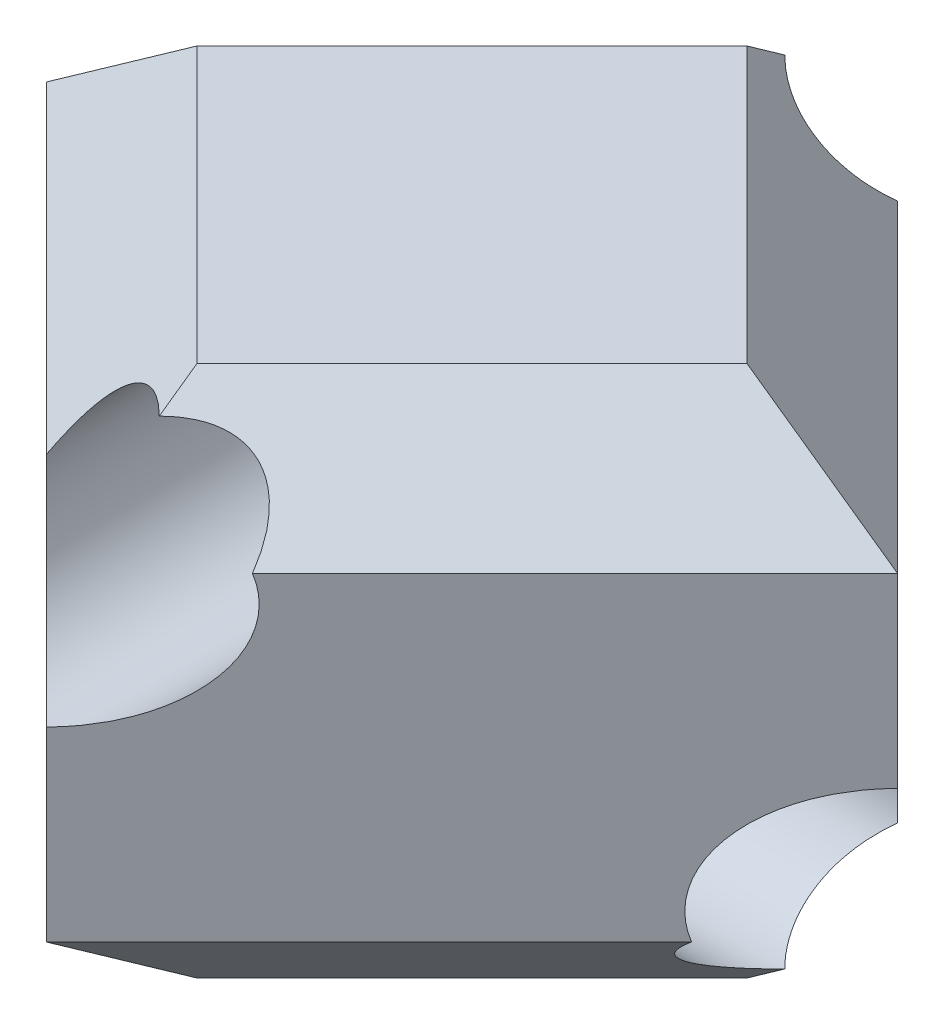
ISO-10303-21;
HEADER;
FILE_DESCRIPTION(('STEP AP214'),'2;1');
FILE_NAME('part.step','',(''),(''),'','','');
FILE_SCHEMA(('AUTOMOTIVE_DESIGN { 1 0 10303 214 1 1 1 1 }'));
ENDSEC;
DATA;
#1=APPLICATION_CONTEXT('core data for automotive mechanical design processes');
#2=APPLICATION_PROTOCOL_DEFINITION('international standard','automotive_design',2000,#1);
#3=PRODUCT_CONTEXT('',#1,'mechanical');
#4=PRODUCT('Part','Part','',(#3));
#5=PRODUCT_RELATED_PRODUCT_CATEGORY('part','',(#4));
#6=PRODUCT_DEFINITION_FORMATION('','',#4);
#7=PRODUCT_DEFINITION_CONTEXT('part definition',#1,'design');
#8=PRODUCT_DEFINITION('design','',#6,#7);
#9=PRODUCT_DEFINITION_SHAPE('','',#8);
#10=(LENGTH_UNIT() NAMED_UNIT(*) SI_UNIT(.MILLI.,.METRE.));
#11=(NAMED_UNIT(*) PLANE_ANGLE_UNIT() SI_UNIT($,.RADIAN.));
#12=(NAMED_UNIT(*) SI_UNIT($,.STERADIAN.) SOLID_ANGLE_UNIT());
#13=UNCERTAINTY_MEASURE_WITH_UNIT(LENGTH_MEASURE(1.E-05),#10,'distance_accuracy_value','');
#14=(GEOMETRIC_REPRESENTATION_CONTEXT(3) GLOBAL_UNCERTAINTY_ASSIGNED_CONTEXT((#13)) GLOBAL_UNIT_ASSIGNED_CONTEXT((#10,
#11,#12)) REPRESENTATION_CONTEXT('',''));
#15=CARTESIAN_POINT('',(0.,0.,0.));
#16=DIRECTION('',(0.,0.,1.));
#17=DIRECTION('',(1.,0.,0.));
#18=AXIS2_PLACEMENT_3D('',#15,#16,#17);
#19=CARTESIAN_POINT('',(0.,25.,0.));
#20=DIRECTION('',(0.707106781186548,0.,-0.707106781186548));
#21=DIRECTION('',(-0.707106781186548,0.,-0.707106781186548));
#22=AXIS2_PLACEMENT_3D('',#19,#20,#21);
#23=PLANE('',#22);
#24=CARTESIAN_POINT('',(0.,6.25,0.));
#25=DIRECTION('',(0.707106781186548,0.,-0.707106781186548));
#26=DIRECTION('',(0.707106781186548,0.,0.707106781186548));
#27=AXIS2_PLACEMENT_3D('',#24,#25,#26);
#28=ELLIPSE('',#27,7.07106781186548,5.);
#29=CARTESIAN_POINT('',(-1.19999999999957E-05,11.25,0.));
#30=VERTEX_POINT('',#29);
#31=CARTESIAN_POINT('',(4.84122918275927,5.,4.84122918275927));
#32=VERTEX_POINT('',#31);
#33=EDGE_CURVE('E173',#30,#32,#28,.T.);
#34=ORIENTED_EDGE('',*,*,#33,.T.);
#35=DIRECTION('',(0.707106781186548,0.,0.707106781186548));
#36=VECTOR('',#35,1.);
#37=CARTESIAN_POINT('',(0.,5.,0.));
#38=LINE('',#37,#36);
#39=CARTESIAN_POINT('',(20.,5.,20.));
#40=VERTEX_POINT('',#39);
#41=EDGE_CURVE('E200',#32,#40,#38,.T.);
#42=ORIENTED_EDGE('',*,*,#41,.T.);
#43=DIRECTION('',(0.,-1.,0.));
#44=VECTOR('',#43,1.);
#45=CARTESIAN_POINT('',(20.,25.,20.));
#46=LINE('',#45,#44);
#47=CARTESIAN_POINT('',(20.,13.75,20.));
#48=VERTEX_POINT('',#47);
#49=EDGE_CURVE('E155',#48,#40,#46,.T.);
#50=ORIENTED_EDGE('',*,*,#49,.F.);
#51=CARTESIAN_POINT('',(20.,18.75,20.));
#52=DIRECTION('',(0.707106781186548,0.,-0.707106781186548));
#53=DIRECTION('',(0.707106781186548,0.,0.707106781186548));
#54=AXIS2_PLACEMENT_3D('',#51,#52,#53);
#55=ELLIPSE('',#54,7.07106781186548,5.);
#56=CARTESIAN_POINT('',(15.1587708172407,20.,15.1587708172407));
#57=VERTEX_POINT('',#56);
#58=EDGE_CURVE('E177',#48,#57,#55,.T.);
#59=ORIENTED_EDGE('',*,*,#58,.T.);
#60=DIRECTION('',(-0.707106781186548,0.,-0.707106781186548));
#61=VECTOR('',#60,1.);
#62=CARTESIAN_POINT('',(0.,20.,0.));
#63=LINE('',#62,#61);
#64=CARTESIAN_POINT('',(0.,20.,0.));
#65=VERTEX_POINT('',#64);
#66=EDGE_CURVE('E196',#57,#65,#63,.T.);
#67=ORIENTED_EDGE('',*,*,#66,.T.);
#68=DIRECTION('',(0.,-1.,0.));
#69=VECTOR('',#68,1.);
#70=CARTESIAN_POINT('',(0.,25.,0.));
#71=LINE('',#70,#69);
#72=EDGE_CURVE('E167',#65,#30,#71,.T.);
#73=ORIENTED_EDGE('',*,*,#72,.T.);
#74=EDGE_LOOP('',(#34,#42,#50,#59,#67,#73));
#75=FACE_BOUND('',#74,.T.);
#76=ADVANCED_FACE('F39',(#75),#23,.F.);
#77=CARTESIAN_POINT('',(20.,25.,20.));
#78=DIRECTION('',(-0.707106781186548,0.,-0.707106781186548));
#79=DIRECTION('',(-0.707106781186548,0.,0.707106781186548));
#80=AXIS2_PLACEMENT_3D('',#77,#78,#79);
#81=PLANE('',#80);
#82=ORIENTED_EDGE('',*,*,#49,.T.);
#83=DIRECTION('',(0.707106781186548,0.,-0.707106781186548));
#84=VECTOR('',#83,1.);
#85=CARTESIAN_POINT('',(20.,5.,20.));
#86=LINE('',#85,#84);
#87=CARTESIAN_POINT('',(35.1587708172407,5.,4.84122918275927));
#88=VERTEX_POINT('',#87);
#89=EDGE_CURVE('E164',#40,#88,#86,.T.);
#90=ORIENTED_EDGE('',*,*,#89,.T.);
#91=CARTESIAN_POINT('',(40.,6.25,0.));
#92=DIRECTION('',(-0.707106781186548,0.,-0.707106781186548));
#93=DIRECTION('',(0.707106781186548,0.,-0.707106781186548));
#94=AXIS2_PLACEMENT_3D('',#91,#92,#93);
#95=ELLIPSE('',#94,7.07106781186548,5.);
#96=CARTESIAN_POINT('',(40.,11.25,0.));
#97=VERTEX_POINT('',#96);
#98=EDGE_CURVE('E160',#88,#97,#95,.T.);
#99=ORIENTED_EDGE('',*,*,#98,.T.);
#100=DIRECTION('',(0.,-1.,0.));
#101=VECTOR('',#100,1.);
#102=CARTESIAN_POINT('',(40.,25.,0.));
#103=LINE('',#102,#101);
#104=CARTESIAN_POINT('',(40.,20.,0.));
#105=VERTEX_POINT('',#104);
#106=EDGE_CURVE('E143',#105,#97,#103,.T.);
#107=ORIENTED_EDGE('',*,*,#106,.F.);
#108=DIRECTION('',(-0.707106781186548,0.,0.707106781186548));
#109=VECTOR('',#108,1.);
#110=CARTESIAN_POINT('',(20.,20.,20.));
#111=LINE('',#110,#109);
#112=CARTESIAN_POINT('',(24.8412291827593,20.,15.1587708172407));
#113=VERTEX_POINT('',#112);
#114=EDGE_CURVE('E286',#105,#113,#111,.T.);
#115=ORIENTED_EDGE('',*,*,#114,.T.);
#116=CARTESIAN_POINT('',(20.,18.75,20.));
#117=DIRECTION('',(-0.707106781186548,0.,-0.707106781186548));
#118=DIRECTION('',(-0.707106781186548,0.,0.707106781186548));
#119=AXIS2_PLACEMENT_3D('',#116,#117,#118);
#120=ELLIPSE('',#119,7.07106781186548,5.);
#121=EDGE_CURVE('E265',#113,#48,#120,.T.);
#122=ORIENTED_EDGE('',*,*,#121,.T.);
#123=EDGE_LOOP('',(#82,#90,#99,#107,#115,#122));
#124=FACE_BOUND('',#123,.T.);
#125=ADVANCED_FACE('F162',(#124),#81,.F.);
#126=CARTESIAN_POINT('',(20.,25.,-20.));
#127=DIRECTION('',(-0.707106781186548,0.,0.707106781186547));
#128=DIRECTION('',(0.707106781186547,0.,0.707106781186548));
#129=AXIS2_PLACEMENT_3D('',#126,#127,#128);
#130=PLANE('',#129);
#131=CARTESIAN_POINT('',(40.,6.25,0.));
#132=DIRECTION('',(-0.707106781186548,0.,0.707106781186547));
#133=DIRECTION('',(0.707106781186547,0.,0.707106781186548));
#134=AXIS2_PLACEMENT_3D('',#131,#132,#133);
#135=ELLIPSE('',#134,7.07106781186548,5.);
#136=CARTESIAN_POINT('',(35.1587708172407,5.,-4.84122918275928));
#137=VERTEX_POINT('',#136);
#138=EDGE_CURVE('E147',#97,#137,#135,.T.);
#139=ORIENTED_EDGE('',*,*,#138,.T.);
#140=DIRECTION('',(-0.707106781186547,0.,-0.707106781186548));
#141=VECTOR('',#140,1.);
#142=CARTESIAN_POINT('',(20.,5.,-20.));
#143=LINE('',#142,#141);
#144=CARTESIAN_POINT('',(20.,5.,-20.));
#145=VERTEX_POINT('',#144);
#146=EDGE_CURVE('E188',#137,#145,#143,.T.);
#147=ORIENTED_EDGE('',*,*,#146,.T.);
#148=DIRECTION('',(0.,-1.,0.));
#149=VECTOR('',#148,1.);
#150=CARTESIAN_POINT('',(20.,25.,-20.));
#151=LINE('',#150,#149);
#152=CARTESIAN_POINT('',(20.,13.75,-20.));
#153=VERTEX_POINT('',#152);
#154=EDGE_CURVE('E156',#153,#145,#151,.T.);
#155=ORIENTED_EDGE('',*,*,#154,.F.);
#156=CARTESIAN_POINT('',(20.,18.75,-20.));
#157=DIRECTION('',(-0.707106781186548,0.,0.707106781186547));
#158=DIRECTION('',(0.707106781186547,0.,0.707106781186548));
#159=AXIS2_PLACEMENT_3D('',#156,#157,#158);
#160=ELLIPSE('',#159,7.07106781186548,5.);
#161=CARTESIAN_POINT('',(24.8412291827593,20.,-15.1587708172407));
#162=VERTEX_POINT('',#161);
#163=EDGE_CURVE('E238',#153,#162,#160,.T.);
#164=ORIENTED_EDGE('',*,*,#163,.T.);
#165=DIRECTION('',(0.707106781186547,0.,0.707106781186548));
#166=VECTOR('',#165,1.);
#167=CARTESIAN_POINT('',(40.,20.,0.));
#168=LINE('',#167,#166);
#169=EDGE_CURVE('E151',#162,#105,#168,.T.);
#170=ORIENTED_EDGE('',*,*,#169,.T.);
#171=ORIENTED_EDGE('',*,*,#106,.T.);
#172=EDGE_LOOP('',(#139,#147,#155,#164,#170,#171));
#173=FACE_BOUND('',#172,.T.);
#174=ADVANCED_FACE('F145',(#173),#130,.F.);
#175=CARTESIAN_POINT('',(0.,25.,0.));
#176=DIRECTION('',(0.707106781186548,0.,0.707106781186547));
#177=DIRECTION('',(0.707106781186547,0.,-0.707106781186548));
#178=AXIS2_PLACEMENT_3D('',#175,#176,#177);
#179=PLANE('',#178);
#180=ORIENTED_EDGE('',*,*,#154,.T.);
#181=DIRECTION('',(-0.707106781186547,0.,0.707106781186548));
#182=VECTOR('',#181,1.);
#183=CARTESIAN_POINT('',(0.,5.,0.));
#184=LINE('',#183,#182);
#185=CARTESIAN_POINT('',(4.84122918275928,5.,-4.84122918275928));
#186=VERTEX_POINT('',#185);
#187=EDGE_CURVE('E193',#145,#186,#184,.T.);
#188=ORIENTED_EDGE('',*,*,#187,.T.);
#189=CARTESIAN_POINT('',(0.,6.25,0.));
#190=DIRECTION('',(0.707106781186548,0.,0.707106781186547));
#191=DIRECTION('',(0.707106781186547,0.,-0.707106781186548));
#192=AXIS2_PLACEMENT_3D('',#189,#190,#191);
#193=ELLIPSE('',#192,7.07106781186548,5.);
#194=EDGE_CURVE('E287',#186,#30,#193,.T.);
#195=ORIENTED_EDGE('',*,*,#194,.T.);
#196=ORIENTED_EDGE('',*,*,#72,.F.);
#197=DIRECTION('',(0.707106781186547,0.,-0.707106781186548));
#198=VECTOR('',#197,1.);
#199=CARTESIAN_POINT('',(20.,20.,-20.));
#200=LINE('',#199,#198);
#201=CARTESIAN_POINT('',(15.1587708172407,20.,-15.1587708172407));
#202=VERTEX_POINT('',#201);
#203=EDGE_CURVE('E190',#65,#202,#200,.T.);
#204=ORIENTED_EDGE('',*,*,#203,.T.);
#205=CARTESIAN_POINT('',(20.,18.75,-20.));
#206=DIRECTION('',(0.707106781186548,0.,0.707106781186547));
#207=DIRECTION('',(-0.707106781186547,0.,0.707106781186548));
#208=AXIS2_PLACEMENT_3D('',#205,#206,#207);
#209=ELLIPSE('',#208,7.07106781186548,5.);
#210=EDGE_CURVE('E283',#202,#153,#209,.T.);
#211=ORIENTED_EDGE('',*,*,#210,.T.);
#212=EDGE_LOOP('',(#180,#188,#195,#196,#204,#211));
#213=FACE_BOUND('',#212,.T.);
#214=ADVANCED_FACE('F282',(#213),#179,.F.);
#215=CARTESIAN_POINT('',(0.,25.,0.));
#216=DIRECTION('',(0.,1.,0.));
#217=DIRECTION('',(0.,0.,1.));
#218=AXIS2_PLACEMENT_3D('',#215,#216,#217);
#219=PLANE('',#218);
#220=DIRECTION('',(-0.707106781186547,0.,0.707106781186548));
#221=VECTOR('',#220,1.);
#222=CARTESIAN_POINT('',(3.53553390593274,25.,3.53553390593273));
#223=LINE('',#222,#221);
#224=CARTESIAN_POINT('',(20.,25.,-12.9289321881345));
#225=VERTEX_POINT('',#224);
#226=CARTESIAN_POINT('',(7.07106781186547,25.,0.));
#227=VERTEX_POINT('',#226);
#228=EDGE_CURVE('E209',#225,#227,#223,.T.);
#229=ORIENTED_EDGE('',*,*,#228,.T.);
#230=DIRECTION('',(0.707106781186548,0.,0.707106781186548));
#231=VECTOR('',#230,1.);
#232=CARTESIAN_POINT('',(23.5355339059327,25.,16.4644660940673));
#233=LINE('',#232,#231);
#234=CARTESIAN_POINT('',(20.,25.,12.9289321881345));
#235=VERTEX_POINT('',#234);
#236=EDGE_CURVE('E212',#227,#235,#233,.T.);
#237=ORIENTED_EDGE('',*,*,#236,.T.);
#238=DIRECTION('',(0.707106781186548,0.,-0.707106781186548));
#239=VECTOR('',#238,1.);
#240=CARTESIAN_POINT('',(36.4644660940673,25.,-3.53553390593274));
#241=LINE('',#240,#239);
#242=CARTESIAN_POINT('',(32.9289321881345,25.,0.));
#243=VERTEX_POINT('',#242);
#244=EDGE_CURVE('E203',#235,#243,#241,.T.);
#245=ORIENTED_EDGE('',*,*,#244,.T.);
#246=DIRECTION('',(-0.707106781186547,0.,-0.707106781186548));
#247=VECTOR('',#246,1.);
#248=CARTESIAN_POINT('',(16.4644660940673,25.,-16.4644660940673));
#249=LINE('',#248,#247);
#250=EDGE_CURVE('E206',#243,#225,#249,.T.);
#251=ORIENTED_EDGE('',*,*,#250,.T.);
#252=EDGE_LOOP('',(#229,#237,#245,#251));
#253=FACE_BOUND('',#252,.T.);
#254=ADVANCED_FACE('F353',(#253),#219,.T.);
#255=CARTESIAN_POINT('',(0.,0.,0.));
#256=DIRECTION('',(0.,1.,0.));
#257=DIRECTION('',(0.,0.,1.));
#258=AXIS2_PLACEMENT_3D('',#255,#256,#257);
#259=PLANE('',#258);
#260=DIRECTION('',(0.707106781186547,0.,0.707106781186548));
#261=VECTOR('',#260,1.);
#262=CARTESIAN_POINT('',(16.4644660940673,0.,-16.4644660940672));
#263=LINE('',#262,#261);
#264=CARTESIAN_POINT('',(20.,0.,-12.9289321881345));
#265=VERTEX_POINT('',#264);
#266=CARTESIAN_POINT('',(32.9289321881345,0.,0.));
#267=VERTEX_POINT('',#266);
#268=EDGE_CURVE('E316',#265,#267,#263,.T.);
#269=ORIENTED_EDGE('',*,*,#268,.T.);
#270=DIRECTION('',(-0.707106781186548,0.,0.707106781186548));
#271=VECTOR('',#270,1.);
#272=CARTESIAN_POINT('',(16.4644660940672,0.,16.4644660940672));
#273=LINE('',#272,#271);
#274=CARTESIAN_POINT('',(20.,0.,12.9289321881345));
#275=VERTEX_POINT('',#274);
#276=EDGE_CURVE('E319',#267,#275,#273,.T.);
#277=ORIENTED_EDGE('',*,*,#276,.T.);
#278=DIRECTION('',(-0.707106781186548,0.,-0.707106781186548));
#279=VECTOR('',#278,1.);
#280=CARTESIAN_POINT('',(3.53553390593275,0.,-3.53553390593275));
#281=LINE('',#280,#279);
#282=CARTESIAN_POINT('',(7.0710678118655,0.,0.));
#283=VERTEX_POINT('',#282);
#284=EDGE_CURVE('E310',#275,#283,#281,.T.);
#285=ORIENTED_EDGE('',*,*,#284,.T.);
#286=DIRECTION('',(0.707106781186547,0.,-0.707106781186548));
#287=VECTOR('',#286,1.);
#288=CARTESIAN_POINT('',(3.53553390593275,0.,3.53553390593275));
#289=LINE('',#288,#287);
#290=EDGE_CURVE('E313',#283,#265,#289,.T.);
#291=ORIENTED_EDGE('',*,*,#290,.T.);
#292=EDGE_LOOP('',(#269,#277,#285,#291));
#293=FACE_BOUND('',#292,.T.);
#294=ADVANCED_FACE('F339',(#293),#259,.F.);
#295=CARTESIAN_POINT('',(-1.2E-05,6.25,0.));
#296=DIRECTION('',(1.,0.,0.));
#297=DIRECTION('',(0.,0.,-1.));
#298=AXIS2_PLACEMENT_3D('',#295,#296,#297);
#299=CYLINDRICAL_SURFACE('',#298,5.);
#300=ORIENTED_EDGE('',*,*,#194,.F.);
#301=CARTESIAN_POINT('',(-1.76776695296638,6.25,0.));
#302=DIRECTION('',(0.499999999999999,0.707106781186549,0.499999999999999));
#303=DIRECTION('',(0.866025403784439,-0.408248290463863,-0.288675134594811));
#304=AXIS2_PLACEMENT_3D('',#301,#302,#303);
#305=ELLIPSE('',#304,10.,5.);
#306=CARTESIAN_POINT('',(5.30330085889913,1.25,0.));
#307=VERTEX_POINT('',#306);
#308=EDGE_CURVE('E302',#186,#307,#305,.F.);
#309=ORIENTED_EDGE('',*,*,#308,.T.);
#310=CARTESIAN_POINT('',(-1.76776695296638,6.25,0.));
#311=DIRECTION('',(0.499999999999999,0.707106781186549,-0.499999999999999));
#312=DIRECTION('',(0.866025403784439,-0.408248290463863,0.288675134594812));
#313=AXIS2_PLACEMENT_3D('',#310,#311,#312);
#314=ELLIPSE('',#313,10.,5.);
#315=EDGE_CURVE('E298',#307,#32,#314,.F.);
#316=ORIENTED_EDGE('',*,*,#315,.T.);
#317=ORIENTED_EDGE('',*,*,#33,.F.);
#318=EDGE_LOOP('',(#300,#309,#316,#317));
#319=FACE_BOUND('',#318,.T.);
#320=ORIENTED_EDGE('',*,*,#98,.F.);
#321=CARTESIAN_POINT('',(41.7677669529664,6.25,0.));
#322=DIRECTION('',(-0.499999999999999,0.707106781186549,-0.499999999999999));
#323=DIRECTION('',(0.866025403784439,0.408248290463863,-0.288675134594812));
#324=AXIS2_PLACEMENT_3D('',#321,#322,#323);
#325=ELLIPSE('',#324,10.,5.);
#326=CARTESIAN_POINT('',(34.6966991411009,1.25,0.));
#327=VERTEX_POINT('',#326);
#328=EDGE_CURVE('E307',#88,#327,#325,.F.);
#329=ORIENTED_EDGE('',*,*,#328,.T.);
#330=CARTESIAN_POINT('',(41.7677669529664,6.25,0.));
#331=DIRECTION('',(-0.499999999999999,0.707106781186549,0.499999999999999));
#332=DIRECTION('',(0.866025403784439,0.408248290463863,0.288675134594812));
#333=AXIS2_PLACEMENT_3D('',#330,#331,#332);
#334=ELLIPSE('',#333,10.,5.);
#335=EDGE_CURVE('E171',#327,#137,#334,.F.);
#336=ORIENTED_EDGE('',*,*,#335,.T.);
#337=ORIENTED_EDGE('',*,*,#138,.F.);
#338=EDGE_LOOP('',(#320,#329,#336,#337));
#339=FACE_BOUND('',#338,.T.);
#340=ADVANCED_FACE('F169',(#319,#339),#299,.F.);
#341=CARTESIAN_POINT('',(20.,18.75,-20.));
#342=DIRECTION('',(0.,0.,1.));
#343=DIRECTION('',(1.,0.,0.));
#344=AXIS2_PLACEMENT_3D('',#341,#342,#343);
#345=CYLINDRICAL_SURFACE('',#344,5.);
#346=ORIENTED_EDGE('',*,*,#210,.F.);
#347=CARTESIAN_POINT('',(20.,18.75,-21.7677669529663));
#348=DIRECTION('',(-0.500000000000001,0.707106781186546,-0.500000000000001));
#349=DIRECTION('',(-0.288675134594814,0.408248290463863,0.866025403784438));
#350=AXIS2_PLACEMENT_3D('',#347,#348,#349);
#351=ELLIPSE('',#350,9.99999999999999,5.);
#352=CARTESIAN_POINT('',(20.,23.75,-14.6966991411009));
#353=VERTEX_POINT('',#352);
#354=EDGE_CURVE('E11',#202,#353,#351,.T.);
#355=ORIENTED_EDGE('',*,*,#354,.T.);
#356=CARTESIAN_POINT('',(20.,18.75,-21.7677669529663));
#357=DIRECTION('',(0.500000000000001,0.707106781186546,-0.500000000000001));
#358=DIRECTION('',(0.288675134594814,0.408248290463863,0.866025403784438));
#359=AXIS2_PLACEMENT_3D('',#356,#357,#358);
#360=ELLIPSE('',#359,9.99999999999999,5.);
#361=EDGE_CURVE('E49',#353,#162,#360,.T.);
#362=ORIENTED_EDGE('',*,*,#361,.T.);
#363=ORIENTED_EDGE('',*,*,#163,.F.);
#364=EDGE_LOOP('',(#346,#355,#362,#363));
#365=FACE_BOUND('',#364,.T.);
#366=CARTESIAN_POINT('',(20.,18.75,21.7677669529663));
#367=DIRECTION('',(0.500000000000001,0.707106781186546,0.500000000000001));
#368=DIRECTION('',(-0.288675134594814,-0.408248290463863,0.866025403784438));
#369=AXIS2_PLACEMENT_3D('',#366,#367,#368);
#370=ELLIPSE('',#369,9.99999999999999,5.);
#371=CARTESIAN_POINT('',(20.,23.75,14.6966991411009));
#372=VERTEX_POINT('',#371);
#373=EDGE_CURVE('E63',#113,#372,#370,.T.);
#374=ORIENTED_EDGE('',*,*,#373,.T.);
#375=CARTESIAN_POINT('',(20.,18.75,21.7677669529663));
#376=DIRECTION('',(-0.500000000000001,0.707106781186547,0.500000000000001));
#377=DIRECTION('',(0.288675134594814,-0.408248290463863,0.866025403784438));
#378=AXIS2_PLACEMENT_3D('',#375,#376,#377);
#379=ELLIPSE('',#378,9.99999999999999,5.);
#380=EDGE_CURVE('E218',#372,#57,#379,.T.);
#381=ORIENTED_EDGE('',*,*,#380,.T.);
#382=ORIENTED_EDGE('',*,*,#58,.F.);
#383=ORIENTED_EDGE('',*,*,#121,.F.);
#384=EDGE_LOOP('',(#374,#381,#382,#383));
#385=FACE_BOUND('',#384,.T.);
#386=ADVANCED_FACE('F261',(#365,#385),#345,.F.);
#387=CARTESIAN_POINT('',(0.,5.,0.));
#388=DIRECTION('',(0.499999999999999,0.707106781186549,0.499999999999999));
#389=DIRECTION('',(-0.707106781186547,0.,0.707106781186548));
#390=AXIS2_PLACEMENT_3D('',#387,#388,#389);
#391=PLANE('',#390);
#392=DIRECTION('',(0.,-0.577350269189624,0.816496580927727));
#393=VECTOR('',#392,1.);
#394=CARTESIAN_POINT('',(20.,-4.42809041582061,-6.66666666666664));
#395=LINE('',#394,#393);
#396=EDGE_CURVE('E230',#265,#145,#395,.F.);
#397=ORIENTED_EDGE('',*,*,#396,.F.);
#398=ORIENTED_EDGE('',*,*,#290,.F.);
#399=DIRECTION('',(0.816496580927727,-0.577350269189624,0.));
#400=VECTOR('',#399,1.);
#401=CARTESIAN_POINT('',(0.,5.,0.));
#402=LINE('',#401,#400);
#403=EDGE_CURVE('E234',#307,#283,#402,.T.);
#404=ORIENTED_EDGE('',*,*,#403,.F.);
#405=ORIENTED_EDGE('',*,*,#308,.F.);
#406=ORIENTED_EDGE('',*,*,#187,.F.);
#407=EDGE_LOOP('',(#397,#398,#404,#405,#406));
#408=FACE_BOUND('',#407,.T.);
#409=ADVANCED_FACE('F331',(#408),#391,.F.);
#410=CARTESIAN_POINT('',(0.,5.,0.));
#411=DIRECTION('',(0.499999999999999,0.707106781186549,-0.499999999999999));
#412=DIRECTION('',(0.707106781186548,0.,0.707106781186548));
#413=AXIS2_PLACEMENT_3D('',#410,#411,#412);
#414=PLANE('',#413);
#415=ORIENTED_EDGE('',*,*,#403,.T.);
#416=ORIENTED_EDGE('',*,*,#284,.F.);
#417=DIRECTION('',(0.,0.577350269189624,0.816496580927727));
#418=VECTOR('',#417,1.);
#419=CARTESIAN_POINT('',(20.,-4.42809041582062,6.66666666666663));
#420=LINE('',#419,#418);
#421=EDGE_CURVE('E227',#40,#275,#420,.F.);
#422=ORIENTED_EDGE('',*,*,#421,.F.);
#423=ORIENTED_EDGE('',*,*,#41,.F.);
#424=ORIENTED_EDGE('',*,*,#315,.F.);
#425=EDGE_LOOP('',(#415,#416,#422,#423,#424));
#426=FACE_BOUND('',#425,.T.);
#427=ADVANCED_FACE('F346',(#426),#414,.F.);
#428=CARTESIAN_POINT('',(20.,5.,-20.));
#429=DIRECTION('',(-0.499999999999999,0.707106781186549,0.499999999999999));
#430=DIRECTION('',(-0.707106781186547,0.,-0.707106781186548));
#431=AXIS2_PLACEMENT_3D('',#428,#429,#430);
#432=PLANE('',#431);
#433=ORIENTED_EDGE('',*,*,#146,.F.);
#434=ORIENTED_EDGE('',*,*,#335,.F.);
#435=DIRECTION('',(-0.816496580927727,-0.577350269189625,0.));
#436=VECTOR('',#435,1.);
#437=CARTESIAN_POINT('',(26.6666666666666,-4.42809041582063,0.));
#438=LINE('',#437,#436);
#439=EDGE_CURVE('E223',#267,#327,#438,.F.);
#440=ORIENTED_EDGE('',*,*,#439,.F.);
#441=ORIENTED_EDGE('',*,*,#268,.F.);
#442=ORIENTED_EDGE('',*,*,#396,.T.);
#443=EDGE_LOOP('',(#433,#434,#440,#441,#442));
#444=FACE_BOUND('',#443,.T.);
#445=ADVANCED_FACE('F335',(#444),#432,.F.);
#446=CARTESIAN_POINT('',(20.,5.,20.));
#447=DIRECTION('',(-0.499999999999999,0.707106781186549,-0.499999999999999));
#448=DIRECTION('',(0.707106781186548,0.,-0.707106781186548));
#449=AXIS2_PLACEMENT_3D('',#446,#447,#448);
#450=PLANE('',#449);
#451=ORIENTED_EDGE('',*,*,#421,.T.);
#452=ORIENTED_EDGE('',*,*,#276,.F.);
#453=ORIENTED_EDGE('',*,*,#439,.T.);
#454=ORIENTED_EDGE('',*,*,#328,.F.);
#455=ORIENTED_EDGE('',*,*,#89,.F.);
#456=EDGE_LOOP('',(#451,#452,#453,#454,#455));
#457=FACE_BOUND('',#456,.T.);
#458=ADVANCED_FACE('F341',(#457),#450,.F.);
#459=CARTESIAN_POINT('',(16.4644660940673,25.,-16.4644660940673));
#460=DIRECTION('',(0.500000000000001,0.707106781186546,-0.500000000000001));
#461=DIRECTION('',(0.707106781186547,0.,0.707106781186548));
#462=AXIS2_PLACEMENT_3D('',#459,#460,#461);
#463=PLANE('',#462);
#464=ORIENTED_EDGE('',*,*,#169,.F.);
#465=ORIENTED_EDGE('',*,*,#361,.F.);
#466=DIRECTION('',(0.,0.577350269189627,0.816496580927725));
#467=VECTOR('',#466,1.);
#468=CARTESIAN_POINT('',(20.,23.3333333333333,-15.2859547920897));
#469=LINE('',#468,#467);
#470=EDGE_CURVE('E43',#225,#353,#469,.F.);
#471=ORIENTED_EDGE('',*,*,#470,.F.);
#472=ORIENTED_EDGE('',*,*,#250,.F.);
#473=DIRECTION('',(-0.816496580927725,0.577350269189627,0.));
#474=VECTOR('',#473,1.);
#475=CARTESIAN_POINT('',(21.9526214587564,32.761423749154,0.));
#476=LINE('',#475,#474);
#477=EDGE_CURVE('E244',#105,#243,#476,.T.);
#478=ORIENTED_EDGE('',*,*,#477,.F.);
#479=EDGE_LOOP('',(#464,#465,#471,#472,#478));
#480=FACE_BOUND('',#479,.T.);
#481=ADVANCED_FACE('F41',(#480),#463,.T.);
#482=CARTESIAN_POINT('',(3.53553390593274,25.,3.53553390593274));
#483=DIRECTION('',(-0.500000000000001,0.707106781186546,-0.500000000000001));
#484=DIRECTION('',(0.707106781186547,0.,-0.707106781186548));
#485=AXIS2_PLACEMENT_3D('',#482,#483,#484);
#486=PLANE('',#485);
#487=ORIENTED_EDGE('',*,*,#354,.F.);
#488=ORIENTED_EDGE('',*,*,#203,.F.);
#489=DIRECTION('',(0.816496580927725,0.577350269189627,0.));
#490=VECTOR('',#489,1.);
#491=CARTESIAN_POINT('',(4.71404520791032,23.3333333333333,0.));
#492=LINE('',#491,#490);
#493=EDGE_CURVE('E242',#227,#65,#492,.F.);
#494=ORIENTED_EDGE('',*,*,#493,.F.);
#495=ORIENTED_EDGE('',*,*,#228,.F.);
#496=ORIENTED_EDGE('',*,*,#470,.T.);
#497=EDGE_LOOP('',(#487,#488,#494,#495,#496));
#498=FACE_BOUND('',#497,.T.);
#499=ADVANCED_FACE('F255',(#498),#486,.T.);
#500=CARTESIAN_POINT('',(16.4644660940673,25.,16.4644660940673));
#501=DIRECTION('',(0.500000000000001,0.707106781186546,0.500000000000001));
#502=DIRECTION('',(-0.707106781186548,0.,0.707106781186548));
#503=AXIS2_PLACEMENT_3D('',#500,#501,#502);
#504=PLANE('',#503);
#505=ORIENTED_EDGE('',*,*,#477,.T.);
#506=ORIENTED_EDGE('',*,*,#244,.F.);
#507=DIRECTION('',(0.,-0.577350269189627,0.816496580927725));
#508=VECTOR('',#507,1.);
#509=CARTESIAN_POINT('',(20.,23.3333333333333,15.2859547920897));
#510=LINE('',#509,#508);
#511=EDGE_CURVE('E239',#372,#235,#510,.F.);
#512=ORIENTED_EDGE('',*,*,#511,.F.);
#513=ORIENTED_EDGE('',*,*,#373,.F.);
#514=ORIENTED_EDGE('',*,*,#114,.F.);
#515=EDGE_LOOP('',(#505,#506,#512,#513,#514));
#516=FACE_BOUND('',#515,.T.);
#517=ADVANCED_FACE('F351',(#516),#504,.T.);
#518=CARTESIAN_POINT('',(3.53553390593274,25.,-3.53553390593274));
#519=DIRECTION('',(-0.500000000000001,0.707106781186547,0.500000000000001));
#520=DIRECTION('',(-0.707106781186548,0.,-0.707106781186548));
#521=AXIS2_PLACEMENT_3D('',#518,#519,#520);
#522=PLANE('',#521);
#523=ORIENTED_EDGE('',*,*,#493,.T.);
#524=ORIENTED_EDGE('',*,*,#66,.F.);
#525=ORIENTED_EDGE('',*,*,#380,.F.);
#526=ORIENTED_EDGE('',*,*,#511,.T.);
#527=ORIENTED_EDGE('',*,*,#236,.F.);
#528=EDGE_LOOP('',(#523,#524,#525,#526,#527));
#529=FACE_BOUND('',#528,.T.);
#530=ADVANCED_FACE('F279',(#529),#522,.T.);
#531=CLOSED_SHELL('',(#76,#125,#174,#214,#254,#294,#340,#386,#409,#427,#445,#458,#481,#499,#517,#530));
#532=MANIFOLD_SOLID_BREP('B2',#531);
#533=ADVANCED_BREP_SHAPE_REPRESENTATION('',(#18,#532),#14);
#534=SHAPE_DEFINITION_REPRESENTATION(#9,#533);
ENDSEC;
END-ISO-10303-21;
